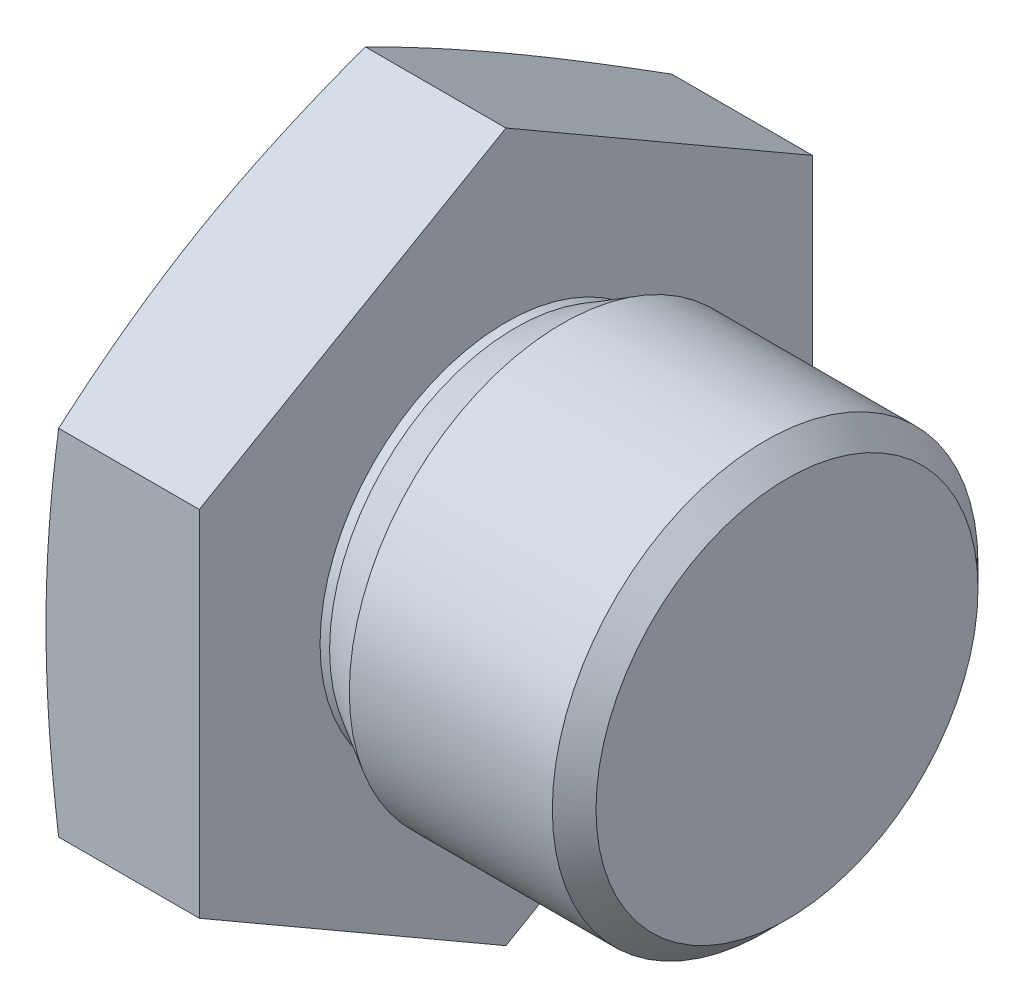
ISO-10303-21;
HEADER;
FILE_DESCRIPTION(('STEP AP214'),'2;1');
FILE_NAME('part.step','',(''),(''),'','','');
FILE_SCHEMA(('AUTOMOTIVE_DESIGN { 1 0 10303 214 1 1 1 1 }'));
ENDSEC;
DATA;
#1=APPLICATION_CONTEXT('core data for automotive mechanical design processes');
#2=APPLICATION_PROTOCOL_DEFINITION('international standard','automotive_design',2000,#1);
#3=PRODUCT_CONTEXT('',#1,'mechanical');
#4=PRODUCT('Part','Part','',(#3));
#5=PRODUCT_RELATED_PRODUCT_CATEGORY('part','',(#4));
#6=PRODUCT_DEFINITION_FORMATION('','',#4);
#7=PRODUCT_DEFINITION_CONTEXT('part definition',#1,'design');
#8=PRODUCT_DEFINITION('design','',#6,#7);
#9=PRODUCT_DEFINITION_SHAPE('','',#8);
#10=(LENGTH_UNIT() NAMED_UNIT(*) SI_UNIT(.MILLI.,.METRE.));
#11=(NAMED_UNIT(*) PLANE_ANGLE_UNIT() SI_UNIT($,.RADIAN.));
#12=(NAMED_UNIT(*) SI_UNIT($,.STERADIAN.) SOLID_ANGLE_UNIT());
#13=UNCERTAINTY_MEASURE_WITH_UNIT(LENGTH_MEASURE(1.E-05),#10,'distance_accuracy_value','');
#14=(GEOMETRIC_REPRESENTATION_CONTEXT(3) GLOBAL_UNCERTAINTY_ASSIGNED_CONTEXT((#13)) GLOBAL_UNIT_ASSIGNED_CONTEXT((#10,
#11,#12)) REPRESENTATION_CONTEXT('',''));
#15=CARTESIAN_POINT('',(0.,0.,0.));
#16=DIRECTION('',(0.,0.,1.));
#17=DIRECTION('',(1.,0.,0.));
#18=AXIS2_PLACEMENT_3D('',#15,#16,#17);
#19=CARTESIAN_POINT('',(11.,3.7375,0.));
#20=DIRECTION('',(1.,0.,0.));
#21=DIRECTION('',(0.,0.,-1.));
#22=AXIS2_PLACEMENT_3D('',#19,#20,#21);
#23=PLANE('',#22);
#24=CARTESIAN_POINT('',(11.,0.,0.));
#25=DIRECTION('',(-1.,0.,0.));
#26=DIRECTION('',(0.,0.,1.));
#27=AXIS2_PLACEMENT_3D('',#24,#25,#26);
#28=CIRCLE('',#27,7.475);
#29=CARTESIAN_POINT('',(11.,0.,7.475));
#30=VERTEX_POINT('',#29);
#31=EDGE_CURVE('E22',#30,#30,#28,.T.);
#32=ORIENTED_EDGE('',*,*,#31,.F.);
#33=EDGE_LOOP('',(#32));
#34=FACE_BOUND('',#33,.T.);
#35=ADVANCED_FACE('F17',(#34),#23,.T.);
#36=CARTESIAN_POINT('',(10.145,0.,0.));
#37=DIRECTION('',(-1.,0.,0.));
#38=DIRECTION('',(0.,0.,1.));
#39=AXIS2_PLACEMENT_3D('',#36,#37,#38);
#40=CONICAL_SURFACE('',#39,8.33,0.785398163397448);
#41=CARTESIAN_POINT('',(10.145,0.,0.));
#42=DIRECTION('',(-1.,0.,0.));
#43=DIRECTION('',(0.,0.,1.));
#44=AXIS2_PLACEMENT_3D('',#41,#42,#43);
#45=CIRCLE('',#44,8.33);
#46=CARTESIAN_POINT('',(10.145,0.,8.33));
#47=VERTEX_POINT('',#46);
#48=EDGE_CURVE('E268',#47,#47,#45,.T.);
#49=ORIENTED_EDGE('',*,*,#48,.F.);
#50=EDGE_LOOP('',(#49));
#51=FACE_BOUND('',#50,.T.);
#52=ORIENTED_EDGE('',*,*,#31,.T.);
#53=EDGE_LOOP('',(#52));
#54=FACE_BOUND('',#53,.T.);
#55=ADVANCED_FACE('F275',(#51,#54),#40,.T.);
#56=CARTESIAN_POINT('',(6.1725,0.,0.));
#57=DIRECTION('',(-1.,0.,0.));
#58=DIRECTION('',(0.,0.,1.));
#59=AXIS2_PLACEMENT_3D('',#56,#57,#58);
#60=CYLINDRICAL_SURFACE('',#59,8.33);
#61=CARTESIAN_POINT('',(2.2,0.,0.));
#62=DIRECTION('',(-1.,0.,0.));
#63=DIRECTION('',(0.,0.,1.));
#64=AXIS2_PLACEMENT_3D('',#61,#62,#63);
#65=CIRCLE('',#64,8.33);
#66=CARTESIAN_POINT('',(2.2,0.,8.33));
#67=VERTEX_POINT('',#66);
#68=EDGE_CURVE('E266',#67,#67,#65,.T.);
#69=ORIENTED_EDGE('',*,*,#68,.F.);
#70=EDGE_LOOP('',(#69));
#71=FACE_BOUND('',#70,.T.);
#72=ORIENTED_EDGE('',*,*,#48,.T.);
#73=EDGE_LOOP('',(#72));
#74=FACE_BOUND('',#73,.T.);
#75=ADVANCED_FACE('F282',(#71,#74),#60,.T.);
#76=CARTESIAN_POINT('',(2.2,0.,0.));
#77=DIRECTION('',(1.,0.,0.));
#78=DIRECTION('',(0.,0.,-1.));
#79=AXIS2_PLACEMENT_3D('',#76,#77,#78);
#80=CONICAL_SURFACE('',#79,8.33,0.523598775598299);
#81=ORIENTED_EDGE('',*,*,#68,.T.);
#82=EDGE_LOOP('',(#81));
#83=FACE_BOUND('',#82,.T.);
#84=CARTESIAN_POINT('',(0.372686398014834,0.,0.));
#85=DIRECTION('',(-1.,0.,0.));
#86=DIRECTION('',(0.,0.,1.));
#87=AXIS2_PLACEMENT_3D('',#84,#85,#86);
#88=CIRCLE('',#87,7.275);
#89=CARTESIAN_POINT('',(0.372686398014834,0.,7.275));
#90=VERTEX_POINT('',#89);
#91=EDGE_CURVE('E263',#90,#90,#88,.T.);
#92=ORIENTED_EDGE('',*,*,#91,.F.);
#93=EDGE_LOOP('',(#92));
#94=FACE_BOUND('',#93,.T.);
#95=ADVANCED_FACE('F288',(#83,#94),#80,.T.);
#96=CARTESIAN_POINT('',(0.186343199007418,0.,0.));
#97=DIRECTION('',(-1.,0.,0.));
#98=DIRECTION('',(0.,0.,1.));
#99=AXIS2_PLACEMENT_3D('',#96,#97,#98);
#100=CYLINDRICAL_SURFACE('',#99,7.275);
#101=ORIENTED_EDGE('',*,*,#91,.T.);
#102=EDGE_LOOP('',(#101));
#103=FACE_BOUND('',#102,.T.);
#104=CARTESIAN_POINT('',(0.,0.,0.));
#105=DIRECTION('',(-1.,0.,0.));
#106=DIRECTION('',(0.,0.,1.));
#107=AXIS2_PLACEMENT_3D('',#104,#105,#106);
#108=CIRCLE('',#107,7.275);
#109=CARTESIAN_POINT('',(0.,0.,7.275));
#110=VERTEX_POINT('',#109);
#111=EDGE_CURVE('E244',#110,#110,#108,.T.);
#112=ORIENTED_EDGE('',*,*,#111,.F.);
#113=EDGE_LOOP('',(#112));
#114=FACE_BOUND('',#113,.T.);
#115=ADVANCED_FACE('F291',(#103,#114),#100,.T.);
#116=CARTESIAN_POINT('',(0.,10.8375,0.));
#117=DIRECTION('',(1.,0.,0.));
#118=DIRECTION('',(0.,1.,0.));
#119=AXIS2_PLACEMENT_3D('',#116,#117,#118);
#120=PLANE('',#119);
#121=DIRECTION('',(0.,0.5,-0.866025403784439));
#122=VECTOR('',#121,1.);
#123=CARTESIAN_POINT('',(0.,-6.92820323027551,-12.));
#124=LINE('',#123,#122);
#125=CARTESIAN_POINT('',(0.,-6.92820323027551,-12.));
#126=VERTEX_POINT('',#125);
#127=CARTESIAN_POINT('',(0.,-13.856406460551,0.));
#128=VERTEX_POINT('',#127);
#129=EDGE_CURVE('E231',#126,#128,#124,.F.);
#130=ORIENTED_EDGE('',*,*,#129,.F.);
#131=DIRECTION('',(0.,1.,0.));
#132=VECTOR('',#131,1.);
#133=CARTESIAN_POINT('',(0.,6.92820323027551,-12.));
#134=LINE('',#133,#132);
#135=CARTESIAN_POINT('',(0.,6.92820323027551,-12.));
#136=VERTEX_POINT('',#135);
#137=EDGE_CURVE('E236',#136,#126,#134,.F.);
#138=ORIENTED_EDGE('',*,*,#137,.F.);
#139=DIRECTION('',(0.,0.5,0.866025403784439));
#140=VECTOR('',#139,1.);
#141=CARTESIAN_POINT('',(0.,13.856406460551,0.));
#142=LINE('',#141,#140);
#143=CARTESIAN_POINT('',(0.,13.856406460551,0.));
#144=VERTEX_POINT('',#143);
#145=EDGE_CURVE('E240',#144,#136,#142,.F.);
#146=ORIENTED_EDGE('',*,*,#145,.F.);
#147=DIRECTION('',(0.,-0.5,0.866025403784439));
#148=VECTOR('',#147,1.);
#149=CARTESIAN_POINT('',(0.,6.92820323027551,12.));
#150=LINE('',#149,#148);
#151=CARTESIAN_POINT('',(0.,6.92820323027551,12.));
#152=VERTEX_POINT('',#151);
#153=EDGE_CURVE('E83',#152,#144,#150,.F.);
#154=ORIENTED_EDGE('',*,*,#153,.F.);
#155=DIRECTION('',(0.,1.,0.));
#156=VECTOR('',#155,1.);
#157=CARTESIAN_POINT('',(0.,-6.92820323027551,12.));
#158=LINE('',#157,#156);
#159=CARTESIAN_POINT('',(0.,-6.92820323027551,12.));
#160=VERTEX_POINT('',#159);
#161=EDGE_CURVE('E80',#160,#152,#158,.T.);
#162=ORIENTED_EDGE('',*,*,#161,.F.);
#163=DIRECTION('',(0.,-0.5,-0.866025403784439));
#164=VECTOR('',#163,1.);
#165=CARTESIAN_POINT('',(0.,-13.856406460551,0.));
#166=LINE('',#165,#164);
#167=EDGE_CURVE('E221',#128,#160,#166,.F.);
#168=ORIENTED_EDGE('',*,*,#167,.F.);
#169=EDGE_LOOP('',(#130,#138,#146,#154,#162,#168));
#170=FACE_BOUND('',#169,.T.);
#171=ORIENTED_EDGE('',*,*,#111,.T.);
#172=EDGE_LOOP('',(#171));
#173=FACE_BOUND('',#172,.T.);
#174=ADVANCED_FACE('F307',(#170,#173),#120,.T.);
#175=CARTESIAN_POINT('',(0.,13.856406460551,0.));
#176=DIRECTION('',(0.,0.866025403784439,-0.5));
#177=DIRECTION('',(0.,0.5,0.866025403784439));
#178=AXIS2_PLACEMENT_3D('',#175,#176,#177);
#179=PLANE('',#178);
#180=ORIENTED_EDGE('',*,*,#145,.T.);
#181=DIRECTION('',(-1.,0.,0.));
#182=VECTOR('',#181,1.);
#183=CARTESIAN_POINT('',(0.,6.92820323027551,-12.));
#184=LINE('',#183,#182);
#185=CARTESIAN_POINT('',(-5.50257738807143,6.92820323027551,-12.));
#186=VERTEX_POINT('',#185);
#187=EDGE_CURVE('E191',#186,#136,#184,.F.);
#188=ORIENTED_EDGE('',*,*,#187,.F.);
#189=CARTESIAN_POINT('',(-6.,10.3923048454133,-5.99999999999998));
#190=CARTESIAN_POINT('',(-6.00001649763333,10.2473817681001,-6.25101413309561));
#191=CARTESIAN_POINT('',(-5.99718651408579,10.102459857364,-6.50202624562051));
#192=CARTESIAN_POINT('',(-5.9859550663348,9.81267449282766,-7.00394922028731));
#193=CARTESIAN_POINT('',(-5.97755378138162,9.66781103729674,-7.25486008542684));
#194=CARTESIAN_POINT('',(-5.95531374244449,9.37835264405024,-7.75621672920703));
#195=CARTESIAN_POINT('',(-5.9414811296808,9.2337575877372,-8.00666271326451));
#196=CARTESIAN_POINT('',(-5.90860818759455,8.94471621193807,-8.50729706163821));
#197=CARTESIAN_POINT('',(-5.88956783992914,8.80026989297768,-8.75748542504391));
#198=CARTESIAN_POINT('',(-5.82505721559326,8.36728561938567,-9.50743618578356));
#199=CARTESIAN_POINT('',(-5.77219088698397,8.07902190001621,-10.0067235937102));
#200=CARTESIAN_POINT('',(-5.64945119441183,7.50306214157445,-11.0043151584465));
#201=CARTESIAN_POINT('',(-5.57955852590088,7.21536712321424,-11.5026175473308));
#202=CARTESIAN_POINT('',(-5.50257738807144,6.9282032302755,-12.));
#203=B_SPLINE_CURVE_WITH_KNOTS('',3,(#189,#190,#191,#192,#193,#194,#195,#196,#197,#198,#199,
#200,#201,#202),.UNSPECIFIED.,.F.,.F.,(4,2,2,2,2,2,4),(0.,0.869520860817989,1.73901374714813,
2.60752631311552,3.47604193822736,5.21259039390097,6.95111699621967),.UNSPECIFIED.);
#204=CARTESIAN_POINT('',(-6.,10.3923048454133,-5.99999999999998));
#205=VERTEX_POINT('',#204);
#206=EDGE_CURVE('E185',#205,#186,#203,.T.);
#207=ORIENTED_EDGE('',*,*,#206,.F.);
#208=CARTESIAN_POINT('',(-5.50257738807144,13.856406460551,0.));
#209=CARTESIAN_POINT('',(-5.57955852590088,13.5692425676123,-0.497382452669172));
#210=CARTESIAN_POINT('',(-5.64945119441184,13.2815475492521,-0.995684841553498));
#211=CARTESIAN_POINT('',(-5.77219088698397,12.7055877908103,-1.99327640628974));
#212=CARTESIAN_POINT('',(-5.82505721559326,12.4173240714408,-2.49256381421642));
#213=CARTESIAN_POINT('',(-5.88956783992914,11.9843397978488,-3.24251457495606));
#214=CARTESIAN_POINT('',(-5.90860818759455,11.8398934788884,-3.49270293836176));
#215=CARTESIAN_POINT('',(-5.9414811296808,11.5508521030893,-3.99333728673546));
#216=CARTESIAN_POINT('',(-5.95531374244449,11.4062570467763,-4.24378327079294));
#217=CARTESIAN_POINT('',(-5.97755378138162,11.1167986535298,-4.74513991457312));
#218=CARTESIAN_POINT('',(-5.9859550663348,10.9719351979989,-4.99605077971266));
#219=CARTESIAN_POINT('',(-5.99718651408579,10.6821498334625,-5.49797375437945));
#220=CARTESIAN_POINT('',(-6.00001649763333,10.5372279227264,-5.74898586690435));
#221=CARTESIAN_POINT('',(-6.,10.3923048454133,-5.99999999999998));
#222=B_SPLINE_CURVE_WITH_KNOTS('',3,(#208,#209,#210,#211,#212,#213,#214,#215,#216,#217,#218,
#219,#220,#221),.UNSPECIFIED.,.F.,.F.,(4,2,2,2,2,2,4),(0.,1.73852660231868,3.47507505799229,
4.34359068310412,5.21210324907151,6.08159613540164,6.95111699621963),.UNSPECIFIED.);
#223=CARTESIAN_POINT('',(-5.50257738807144,13.856406460551,0.));
#224=VERTEX_POINT('',#223);
#225=EDGE_CURVE('E189',#224,#205,#222,.T.);
#226=ORIENTED_EDGE('',*,*,#225,.F.);
#227=DIRECTION('',(1.,0.,0.));
#228=VECTOR('',#227,1.);
#229=CARTESIAN_POINT('',(0.,13.856406460551,0.));
#230=LINE('',#229,#228);
#231=EDGE_CURVE('E248',#144,#224,#230,.F.);
#232=ORIENTED_EDGE('',*,*,#231,.F.);
#233=EDGE_LOOP('',(#180,#188,#207,#226,#232));
#234=FACE_BOUND('',#233,.T.);
#235=ADVANCED_FACE('F187',(#234),#179,.T.);
#236=CARTESIAN_POINT('',(0.,6.92820323027551,-12.));
#237=DIRECTION('',(0.,0.,-1.));
#238=DIRECTION('',(-1.,0.,0.));
#239=AXIS2_PLACEMENT_3D('',#236,#237,#238);
#240=PLANE('',#239);
#241=ORIENTED_EDGE('',*,*,#137,.T.);
#242=DIRECTION('',(1.,0.,0.));
#243=VECTOR('',#242,1.);
#244=CARTESIAN_POINT('',(0.,-6.92820323027551,-12.));
#245=LINE('',#244,#243);
#246=CARTESIAN_POINT('',(-5.50257738807143,-6.92820323027551,-12.));
#247=VERTEX_POINT('',#246);
#248=EDGE_CURVE('E234',#247,#126,#245,.T.);
#249=ORIENTED_EDGE('',*,*,#248,.F.);
#250=CARTESIAN_POINT('',(-5.99999999999999,0.,-12.));
#251=CARTESIAN_POINT('',(-6.00001649763332,-0.289846154626323,-12.));
#252=CARTESIAN_POINT('',(-5.99718651408578,-0.579689976098541,-12.));
#253=CARTESIAN_POINT('',(-5.98595506633479,-1.1592607051712,-12.));
#254=CARTESIAN_POINT('',(-5.97755378138162,-1.44898761623303,-12.));
#255=CARTESIAN_POINT('',(-5.95531374244449,-2.02790440272603,-12.));
#256=CARTESIAN_POINT('',(-5.94148112968079,-2.31709451535212,-12.));
#257=CARTESIAN_POINT('',(-5.90860818759455,-2.89517726695037,-12.));
#258=CARTESIAN_POINT('',(-5.88956783992914,-3.18406990487116,-12.));
#259=CARTESIAN_POINT('',(-5.82505721559326,-4.05003845205516,-12.));
#260=CARTESIAN_POINT('',(-5.77219088698397,-4.62656589079408,-12.));
#261=CARTESIAN_POINT('',(-5.64945119441183,-5.77848540767762,-12.));
#262=CARTESIAN_POINT('',(-5.57955852590087,-6.35387544439802,-12.));
#263=CARTESIAN_POINT('',(-5.50257738807143,-6.92820323027551,-12.));
#264=B_SPLINE_CURVE_WITH_KNOTS('',3,(#250,#251,#252,#253,#254,#255,#256,#257,#258,#259,#260,
#261,#262,#263),.UNSPECIFIED.,.F.,.F.,(4,2,2,2,2,2,4),(0.,0.869520860817986,1.73901374714813,
2.60752631311551,3.47604193822735,5.21259039390096,6.95111699621965),.UNSPECIFIED.);
#265=CARTESIAN_POINT('',(-6.,0.,-12.));
#266=VERTEX_POINT('',#265);
#267=EDGE_CURVE('E207',#266,#247,#264,.T.);
#268=ORIENTED_EDGE('',*,*,#267,.F.);
#269=CARTESIAN_POINT('',(-5.50257738807143,6.92820323027551,-12.));
#270=CARTESIAN_POINT('',(-5.57955852590087,6.35387544439802,-12.));
#271=CARTESIAN_POINT('',(-5.64945119441183,5.77848540767762,-12.));
#272=CARTESIAN_POINT('',(-5.77219088698397,4.62656589079408,-12.));
#273=CARTESIAN_POINT('',(-5.82505721559326,4.05003845205516,-12.));
#274=CARTESIAN_POINT('',(-5.88956783992914,3.18406990487116,-12.));
#275=CARTESIAN_POINT('',(-5.90860818759455,2.89517726695037,-12.));
#276=CARTESIAN_POINT('',(-5.94148112968079,2.31709451535211,-12.));
#277=CARTESIAN_POINT('',(-5.95531374244448,2.02790440272603,-12.));
#278=CARTESIAN_POINT('',(-5.97755378138162,1.44898761623303,-12.));
#279=CARTESIAN_POINT('',(-5.98595506633479,1.1592607051712,-12.));
#280=CARTESIAN_POINT('',(-5.99718651408579,0.579689976098541,-12.));
#281=CARTESIAN_POINT('',(-6.00001649763332,0.289846154626323,-12.));
#282=CARTESIAN_POINT('',(-5.99999999999999,0.,-12.));
#283=B_SPLINE_CURVE_WITH_KNOTS('',3,(#269,#270,#271,#272,#273,#274,#275,#276,#277,#278,#279,
#280,#281,#282),.UNSPECIFIED.,.F.,.F.,(4,2,2,2,2,2,4),(0.,1.73852660231869,3.4750750579923,
4.34359068310414,5.21210324907153,6.08159613540166,6.95111699621965),.UNSPECIFIED.);
#284=EDGE_CURVE('E196',#186,#266,#283,.T.);
#285=ORIENTED_EDGE('',*,*,#284,.F.);
#286=ORIENTED_EDGE('',*,*,#187,.T.);
#287=EDGE_LOOP('',(#241,#249,#268,#285,#286));
#288=FACE_BOUND('',#287,.T.);
#289=ADVANCED_FACE('F318',(#288),#240,.T.);
#290=CARTESIAN_POINT('',(0.,-6.92820323027551,-12.));
#291=DIRECTION('',(0.,-0.866025403784439,-0.5));
#292=DIRECTION('',(0.,0.5,-0.866025403784439));
#293=AXIS2_PLACEMENT_3D('',#290,#291,#292);
#294=PLANE('',#293);
#295=ORIENTED_EDGE('',*,*,#129,.T.);
#296=DIRECTION('',(1.,0.,0.));
#297=VECTOR('',#296,1.);
#298=CARTESIAN_POINT('',(0.,-13.856406460551,0.));
#299=LINE('',#298,#297);
#300=CARTESIAN_POINT('',(-5.50257738807144,-13.856406460551,0.));
#301=VERTEX_POINT('',#300);
#302=EDGE_CURVE('E217',#301,#128,#299,.T.);
#303=ORIENTED_EDGE('',*,*,#302,.F.);
#304=CARTESIAN_POINT('',(-5.99999999999999,-10.3923048454133,-5.99999999999998));
#305=CARTESIAN_POINT('',(-6.00001649763332,-10.5372279227264,-5.74898586690436));
#306=CARTESIAN_POINT('',(-5.99718651408579,-10.6821498334625,-5.49797375437946));
#307=CARTESIAN_POINT('',(-5.98595506633479,-10.9719351979989,-4.99605077971266));
#308=CARTESIAN_POINT('',(-5.97755378138162,-11.1167986535298,-4.74513991457313));
#309=CARTESIAN_POINT('',(-5.95531374244449,-11.4062570467763,-4.24378327079294));
#310=CARTESIAN_POINT('',(-5.94148112968079,-11.5508521030893,-3.99333728673547));
#311=CARTESIAN_POINT('',(-5.90860818759455,-11.8398934788885,-3.49270293836177));
#312=CARTESIAN_POINT('',(-5.88956783992914,-11.9843397978488,-3.24251457495607));
#313=CARTESIAN_POINT('',(-5.82505721559326,-12.4173240714408,-2.49256381421643));
#314=CARTESIAN_POINT('',(-5.77219088698397,-12.7055877908103,-1.99327640628974));
#315=CARTESIAN_POINT('',(-5.64945119441183,-13.2815475492521,-0.995684841553507));
#316=CARTESIAN_POINT('',(-5.57955852590088,-13.5692425676123,-0.497382452669181));
#317=CARTESIAN_POINT('',(-5.50257738807144,-13.856406460551,0.));
#318=B_SPLINE_CURVE_WITH_KNOTS('',3,(#304,#305,#306,#307,#308,#309,#310,#311,#312,#313,#314,
#315,#316,#317),.UNSPECIFIED.,.F.,.F.,(4,2,2,2,2,2,4),(0.,0.869520860817983,1.73901374714812,
2.6075263131155,3.47604193822733,5.21259039390094,6.95111699621962),.UNSPECIFIED.);
#319=CARTESIAN_POINT('',(-6.,-10.3923048454133,-5.99999999999998));
#320=VERTEX_POINT('',#319);
#321=EDGE_CURVE('E136',#320,#301,#318,.T.);
#322=ORIENTED_EDGE('',*,*,#321,.F.);
#323=CARTESIAN_POINT('',(-5.50257738807143,-6.92820323027551,-12.));
#324=CARTESIAN_POINT('',(-5.57955852590088,-7.21536712321426,-11.5026175473308));
#325=CARTESIAN_POINT('',(-5.64945119441183,-7.50306214157446,-11.0043151584465));
#326=CARTESIAN_POINT('',(-5.77219088698397,-8.07902190001623,-10.0067235937102));
#327=CARTESIAN_POINT('',(-5.82505721559326,-8.36728561938569,-9.50743618578356));
#328=CARTESIAN_POINT('',(-5.88956783992914,-8.80026989297769,-8.75748542504392));
#329=CARTESIAN_POINT('',(-5.90860818759455,-8.94471621193808,-8.50729706163821));
#330=CARTESIAN_POINT('',(-5.94148112968079,-9.23375758773721,-8.00666271326451));
#331=CARTESIAN_POINT('',(-5.95531374244449,-9.37835264405026,-7.75621672920704));
#332=CARTESIAN_POINT('',(-5.97755378138162,-9.66781103729676,-7.25486008542685));
#333=CARTESIAN_POINT('',(-5.98595506633479,-9.81267449282767,-7.00394922028731));
#334=CARTESIAN_POINT('',(-5.99718651408579,-10.102459857364,-6.50202624562052));
#335=CARTESIAN_POINT('',(-6.00001649763332,-10.2473817681001,-6.25101413309561));
#336=CARTESIAN_POINT('',(-5.99999999999999,-10.3923048454133,-5.99999999999998));
#337=B_SPLINE_CURVE_WITH_KNOTS('',3,(#323,#324,#325,#326,#327,#328,#329,#330,#331,#332,#333,
#334,#335,#336),.UNSPECIFIED.,.F.,.F.,(4,2,2,2,2,2,4),(0.,1.73852660231869,3.47507505799231,
4.34359068310415,5.21210324907154,6.08159613540168,6.95111699621967),.UNSPECIFIED.);
#338=EDGE_CURVE('E195',#247,#320,#337,.T.);
#339=ORIENTED_EDGE('',*,*,#338,.F.);
#340=ORIENTED_EDGE('',*,*,#248,.T.);
#341=EDGE_LOOP('',(#295,#303,#322,#339,#340));
#342=FACE_BOUND('',#341,.T.);
#343=ADVANCED_FACE('F120',(#342),#294,.T.);
#344=CARTESIAN_POINT('',(0.,-13.856406460551,0.));
#345=DIRECTION('',(0.,-0.866025403784439,0.5));
#346=DIRECTION('',(0.,-0.5,-0.866025403784439));
#347=AXIS2_PLACEMENT_3D('',#344,#345,#346);
#348=PLANE('',#347);
#349=DIRECTION('',(1.,0.,0.));
#350=VECTOR('',#349,1.);
#351=CARTESIAN_POINT('',(0.,-6.92820323027551,12.));
#352=LINE('',#351,#350);
#353=CARTESIAN_POINT('',(-5.50257738807144,-6.92820323027551,12.));
#354=VERTEX_POINT('',#353);
#355=EDGE_CURVE('E218',#354,#160,#352,.T.);
#356=ORIENTED_EDGE('',*,*,#355,.F.);
#357=CARTESIAN_POINT('',(-6.,-10.3923048454133,5.99999999999998));
#358=CARTESIAN_POINT('',(-6.00001649763332,-10.2473817681001,6.25101413309561));
#359=CARTESIAN_POINT('',(-5.99718651408579,-10.102459857364,6.50202624562051));
#360=CARTESIAN_POINT('',(-5.9859550663348,-9.81267449282766,7.00394922028731));
#361=CARTESIAN_POINT('',(-5.97755378138162,-9.66781103729674,7.25486008542684));
#362=CARTESIAN_POINT('',(-5.95531374244449,-9.37835264405024,7.75621672920703));
#363=CARTESIAN_POINT('',(-5.9414811296808,-9.2337575877372,8.00666271326451));
#364=CARTESIAN_POINT('',(-5.90860818759455,-8.94471621193807,8.50729706163821));
#365=CARTESIAN_POINT('',(-5.88956783992914,-8.80026989297768,8.75748542504391));
#366=CARTESIAN_POINT('',(-5.82505721559326,-8.36728561938568,9.50743618578356));
#367=CARTESIAN_POINT('',(-5.77219088698397,-8.07902190001621,10.0067235937102));
#368=CARTESIAN_POINT('',(-5.64945119441183,-7.50306214157444,11.0043151584465));
#369=CARTESIAN_POINT('',(-5.57955852590088,-7.21536712321424,11.5026175473308));
#370=CARTESIAN_POINT('',(-5.50257738807144,-6.9282032302755,12.));
#371=B_SPLINE_CURVE_WITH_KNOTS('',3,(#357,#358,#359,#360,#361,#362,#363,#364,#365,#366,#367,
#368,#369,#370),.UNSPECIFIED.,.F.,.F.,(4,2,2,2,2,2,4),(0.,0.869520860817988,1.73901374714813,
2.60752631311552,3.47604193822736,5.21259039390097,6.95111699621967),.UNSPECIFIED.);
#372=CARTESIAN_POINT('',(-6.,-10.3923048454133,5.99999999999998));
#373=VERTEX_POINT('',#372);
#374=EDGE_CURVE('E95',#373,#354,#371,.T.);
#375=ORIENTED_EDGE('',*,*,#374,.F.);
#376=CARTESIAN_POINT('',(-5.50257738807144,-13.856406460551,0.));
#377=CARTESIAN_POINT('',(-5.57955852590088,-13.5692425676123,0.497382452669172));
#378=CARTESIAN_POINT('',(-5.64945119441183,-13.2815475492521,0.995684841553498));
#379=CARTESIAN_POINT('',(-5.77219088698397,-12.7055877908103,1.99327640628974));
#380=CARTESIAN_POINT('',(-5.82505721559326,-12.4173240714408,2.49256381421642));
#381=CARTESIAN_POINT('',(-5.88956783992915,-11.9843397978488,3.24251457495606));
#382=CARTESIAN_POINT('',(-5.90860818759456,-11.8398934788884,3.49270293836176));
#383=CARTESIAN_POINT('',(-5.9414811296808,-11.5508521030893,3.99333728673546));
#384=CARTESIAN_POINT('',(-5.95531374244449,-11.4062570467763,4.24378327079294));
#385=CARTESIAN_POINT('',(-5.97755378138162,-11.1167986535298,4.74513991457312));
#386=CARTESIAN_POINT('',(-5.9859550663348,-10.9719351979989,4.99605077971266));
#387=CARTESIAN_POINT('',(-5.99718651408579,-10.6821498334625,5.49797375437945));
#388=CARTESIAN_POINT('',(-6.00001649763333,-10.5372279227264,5.74898586690435));
#389=CARTESIAN_POINT('',(-6.,-10.3923048454133,5.99999999999998));
#390=B_SPLINE_CURVE_WITH_KNOTS('',3,(#376,#377,#378,#379,#380,#381,#382,#383,#384,#385,#386,
#387,#388,#389),.UNSPECIFIED.,.F.,.F.,(4,2,2,2,2,2,4),(0.,1.73852660231868,3.47507505799229,
4.34359068310412,5.21210324907151,6.08159613540164,6.95111699621963),.UNSPECIFIED.);
#391=EDGE_CURVE('E129',#301,#373,#390,.T.);
#392=ORIENTED_EDGE('',*,*,#391,.F.);
#393=ORIENTED_EDGE('',*,*,#302,.T.);
#394=ORIENTED_EDGE('',*,*,#167,.T.);
#395=EDGE_LOOP('',(#356,#375,#392,#393,#394));
#396=FACE_BOUND('',#395,.T.);
#397=ADVANCED_FACE('F113',(#396),#348,.T.);
#398=CARTESIAN_POINT('',(0.,-6.92820323027551,12.));
#399=DIRECTION('',(0.,0.,1.));
#400=DIRECTION('',(1.,0.,0.));
#401=AXIS2_PLACEMENT_3D('',#398,#399,#400);
#402=PLANE('',#401);
#403=DIRECTION('',(1.,0.,0.));
#404=VECTOR('',#403,1.);
#405=CARTESIAN_POINT('',(0.,6.92820323027551,12.));
#406=LINE('',#405,#404);
#407=CARTESIAN_POINT('',(-5.50257738807144,6.92820323027551,12.));
#408=VERTEX_POINT('',#407);
#409=EDGE_CURVE('E75',#408,#152,#406,.T.);
#410=ORIENTED_EDGE('',*,*,#409,.F.);
#411=CARTESIAN_POINT('',(-5.99999999999999,0.,12.));
#412=CARTESIAN_POINT('',(-6.00001649763332,0.289846154626323,12.));
#413=CARTESIAN_POINT('',(-5.99718651408579,0.579689976098541,12.));
#414=CARTESIAN_POINT('',(-5.98595506633479,1.1592607051712,12.));
#415=CARTESIAN_POINT('',(-5.97755378138162,1.44898761623303,12.));
#416=CARTESIAN_POINT('',(-5.95531374244449,2.02790440272603,12.));
#417=CARTESIAN_POINT('',(-5.94148112968079,2.31709451535212,12.));
#418=CARTESIAN_POINT('',(-5.90860818759455,2.89517726695037,12.));
#419=CARTESIAN_POINT('',(-5.88956783992914,3.18406990487116,12.));
#420=CARTESIAN_POINT('',(-5.82505721559326,4.05003845205516,12.));
#421=CARTESIAN_POINT('',(-5.77219088698397,4.62656589079408,12.));
#422=CARTESIAN_POINT('',(-5.64945119441183,5.77848540767762,12.));
#423=CARTESIAN_POINT('',(-5.57955852590087,6.35387544439802,12.));
#424=CARTESIAN_POINT('',(-5.50257738807144,6.92820323027551,12.));
#425=B_SPLINE_CURVE_WITH_KNOTS('',3,(#411,#412,#413,#414,#415,#416,#417,#418,#419,#420,#421,
#422,#423,#424),.UNSPECIFIED.,.F.,.F.,(4,2,2,2,2,2,4),(0.,0.869520860817986,1.73901374714813,
2.60752631311551,3.47604193822735,5.21259039390096,6.95111699621965),.UNSPECIFIED.);
#426=CARTESIAN_POINT('',(-6.,0.,12.));
#427=VERTEX_POINT('',#426);
#428=EDGE_CURVE('E37',#427,#408,#425,.T.);
#429=ORIENTED_EDGE('',*,*,#428,.F.);
#430=CARTESIAN_POINT('',(-5.50257738807144,-6.92820323027551,12.));
#431=CARTESIAN_POINT('',(-5.57955852590087,-6.35387544439802,12.));
#432=CARTESIAN_POINT('',(-5.64945119441183,-5.77848540767762,12.));
#433=CARTESIAN_POINT('',(-5.77219088698397,-4.62656589079408,12.));
#434=CARTESIAN_POINT('',(-5.82505721559326,-4.05003845205516,12.));
#435=CARTESIAN_POINT('',(-5.88956783992914,-3.18406990487116,12.));
#436=CARTESIAN_POINT('',(-5.90860818759455,-2.89517726695037,12.));
#437=CARTESIAN_POINT('',(-5.94148112968079,-2.31709451535212,12.));
#438=CARTESIAN_POINT('',(-5.95531374244449,-2.02790440272603,12.));
#439=CARTESIAN_POINT('',(-5.97755378138162,-1.44898761623303,12.));
#440=CARTESIAN_POINT('',(-5.98595506633479,-1.1592607051712,12.));
#441=CARTESIAN_POINT('',(-5.99718651408579,-0.579689976098541,12.));
#442=CARTESIAN_POINT('',(-6.00001649763332,-0.289846154626324,12.));
#443=CARTESIAN_POINT('',(-5.99999999999999,0.,12.));
#444=B_SPLINE_CURVE_WITH_KNOTS('',3,(#430,#431,#432,#433,#434,#435,#436,#437,#438,#439,#440,
#441,#442,#443),.UNSPECIFIED.,.F.,.F.,(4,2,2,2,2,2,4),(0.,1.73852660231869,3.4750750579923,
4.34359068310414,5.21210324907152,6.08159613540166,6.95111699621965),.UNSPECIFIED.);
#445=EDGE_CURVE('E93',#354,#427,#444,.T.);
#446=ORIENTED_EDGE('',*,*,#445,.F.);
#447=ORIENTED_EDGE('',*,*,#355,.T.);
#448=ORIENTED_EDGE('',*,*,#161,.T.);
#449=EDGE_LOOP('',(#410,#429,#446,#447,#448));
#450=FACE_BOUND('',#449,.T.);
#451=ADVANCED_FACE('F76',(#450),#402,.T.);
#452=CARTESIAN_POINT('',(0.,6.92820323027551,12.));
#453=DIRECTION('',(0.,0.866025403784439,0.5));
#454=DIRECTION('',(0.,-0.5,0.866025403784439));
#455=AXIS2_PLACEMENT_3D('',#452,#453,#454);
#456=PLANE('',#455);
#457=ORIENTED_EDGE('',*,*,#231,.T.);
#458=CARTESIAN_POINT('',(-5.99999999999999,10.3923048454133,5.99999999999998));
#459=CARTESIAN_POINT('',(-6.00001649763332,10.5372279227264,5.74898586690436));
#460=CARTESIAN_POINT('',(-5.99718651408579,10.6821498334625,5.49797375437946));
#461=CARTESIAN_POINT('',(-5.98595506633479,10.9719351979989,4.99605077971266));
#462=CARTESIAN_POINT('',(-5.97755378138162,11.1167986535298,4.74513991457313));
#463=CARTESIAN_POINT('',(-5.95531374244449,11.4062570467763,4.24378327079294));
#464=CARTESIAN_POINT('',(-5.94148112968079,11.5508521030893,3.99333728673547));
#465=CARTESIAN_POINT('',(-5.90860818759455,11.8398934788885,3.49270293836177));
#466=CARTESIAN_POINT('',(-5.88956783992914,11.9843397978488,3.24251457495607));
#467=CARTESIAN_POINT('',(-5.82505721559326,12.4173240714408,2.49256381421642));
#468=CARTESIAN_POINT('',(-5.77219088698397,12.7055877908103,1.99327640628974));
#469=CARTESIAN_POINT('',(-5.64945119441183,13.2815475492521,0.995684841553505));
#470=CARTESIAN_POINT('',(-5.57955852590087,13.5692425676123,0.497382452669178));
#471=CARTESIAN_POINT('',(-5.50257738807144,13.856406460551,0.));
#472=B_SPLINE_CURVE_WITH_KNOTS('',3,(#458,#459,#460,#461,#462,#463,#464,#465,#466,#467,#468,
#469,#470,#471),.UNSPECIFIED.,.F.,.F.,(4,2,2,2,2,2,4),(0.,0.869520860817982,1.73901374714812,
2.6075263131155,3.47604193822734,5.21259039390094,6.95111699621963),.UNSPECIFIED.);
#473=CARTESIAN_POINT('',(-6.,10.3923048454133,5.99999999999999));
#474=VERTEX_POINT('',#473);
#475=EDGE_CURVE('E71',#474,#224,#472,.T.);
#476=ORIENTED_EDGE('',*,*,#475,.F.);
#477=CARTESIAN_POINT('',(-5.50257738807144,6.92820323027551,12.));
#478=CARTESIAN_POINT('',(-5.57955852590087,7.21536712321426,11.5026175473308));
#479=CARTESIAN_POINT('',(-5.64945119441183,7.50306214157446,11.0043151584465));
#480=CARTESIAN_POINT('',(-5.77219088698397,8.07902190001623,10.0067235937102));
#481=CARTESIAN_POINT('',(-5.82505721559326,8.36728561938569,9.50743618578356));
#482=CARTESIAN_POINT('',(-5.88956783992914,8.80026989297769,8.75748542504392));
#483=CARTESIAN_POINT('',(-5.90860818759455,8.94471621193808,8.50729706163821));
#484=CARTESIAN_POINT('',(-5.94148112968079,9.23375758773721,8.00666271326451));
#485=CARTESIAN_POINT('',(-5.95531374244449,9.37835264405026,7.75621672920704));
#486=CARTESIAN_POINT('',(-5.97755378138162,9.66781103729676,7.25486008542685));
#487=CARTESIAN_POINT('',(-5.98595506633479,9.81267449282767,7.00394922028731));
#488=CARTESIAN_POINT('',(-5.99718651408579,10.102459857364,6.50202624562051));
#489=CARTESIAN_POINT('',(-6.00001649763332,10.2473817681001,6.25101413309561));
#490=CARTESIAN_POINT('',(-5.99999999999999,10.3923048454133,5.99999999999998));
#491=B_SPLINE_CURVE_WITH_KNOTS('',3,(#477,#478,#479,#480,#481,#482,#483,#484,#485,#486,#487,
#488,#489,#490),.UNSPECIFIED.,.F.,.F.,(4,2,2,2,2,2,4),(0.,1.73852660231869,3.47507505799231,
4.34359068310415,5.21210324907154,6.08159613540168,6.95111699621967),.UNSPECIFIED.);
#492=EDGE_CURVE('E86',#408,#474,#491,.T.);
#493=ORIENTED_EDGE('',*,*,#492,.F.);
#494=ORIENTED_EDGE('',*,*,#409,.T.);
#495=ORIENTED_EDGE('',*,*,#153,.T.);
#496=EDGE_LOOP('',(#457,#476,#493,#494,#495));
#497=FACE_BOUND('',#496,.T.);
#498=ADVANCED_FACE('F87',(#497),#456,.T.);
#499=CARTESIAN_POINT('',(-5.49959285239987,0.,0.));
#500=DIRECTION('',(1.,0.,0.));
#501=DIRECTION('',(0.,0.,-1.));
#502=AXIS2_PLACEMENT_3D('',#499,#500,#501);
#503=CONICAL_SURFACE('',#502,13.8675448993144,1.30899693899575);
#504=ORIENTED_EDGE('',*,*,#225,.T.);
#505=CARTESIAN_POINT('',(-6.,0.,0.));
#506=DIRECTION('',(-1.,0.,0.));
#507=DIRECTION('',(0.,0.,1.));
#508=AXIS2_PLACEMENT_3D('',#505,#506,#507);
#509=CIRCLE('',#508,12.);
#510=EDGE_CURVE('E90',#474,#205,#509,.T.);
#511=ORIENTED_EDGE('',*,*,#510,.F.);
#512=ORIENTED_EDGE('',*,*,#475,.T.);
#513=EDGE_LOOP('',(#504,#511,#512));
#514=FACE_BOUND('',#513,.T.);
#515=ADVANCED_FACE('F198',(#514),#503,.T.);
#516=CARTESIAN_POINT('',(-5.49959285239987,0.,0.));
#517=DIRECTION('',(1.,0.,0.));
#518=DIRECTION('',(0.,0.,-1.));
#519=AXIS2_PLACEMENT_3D('',#516,#517,#518);
#520=CONICAL_SURFACE('',#519,13.8675448993143,1.30899693899575);
#521=CARTESIAN_POINT('',(-6.,0.,0.));
#522=DIRECTION('',(-1.,0.,0.));
#523=DIRECTION('',(0.,0.,1.));
#524=AXIS2_PLACEMENT_3D('',#521,#522,#523);
#525=CIRCLE('',#524,12.);
#526=EDGE_CURVE('E176',#205,#266,#525,.T.);
#527=ORIENTED_EDGE('',*,*,#526,.F.);
#528=ORIENTED_EDGE('',*,*,#206,.T.);
#529=ORIENTED_EDGE('',*,*,#284,.T.);
#530=EDGE_LOOP('',(#527,#528,#529));
#531=FACE_BOUND('',#530,.T.);
#532=ADVANCED_FACE('F200',(#531),#520,.T.);
#533=CARTESIAN_POINT('',(-5.49959285239986,0.,0.));
#534=DIRECTION('',(1.,0.,0.));
#535=DIRECTION('',(0.,0.,-1.));
#536=AXIS2_PLACEMENT_3D('',#533,#534,#535);
#537=CONICAL_SURFACE('',#536,13.8675448993143,1.30899693899575);
#538=CARTESIAN_POINT('',(-6.,0.,0.));
#539=DIRECTION('',(-1.,0.,0.));
#540=DIRECTION('',(0.,0.,1.));
#541=AXIS2_PLACEMENT_3D('',#538,#539,#540);
#542=CIRCLE('',#541,12.);
#543=EDGE_CURVE('E171',#266,#320,#542,.T.);
#544=ORIENTED_EDGE('',*,*,#543,.F.);
#545=ORIENTED_EDGE('',*,*,#267,.T.);
#546=ORIENTED_EDGE('',*,*,#338,.T.);
#547=EDGE_LOOP('',(#544,#545,#546));
#548=FACE_BOUND('',#547,.T.);
#549=ADVANCED_FACE('F146',(#548),#537,.T.);
#550=CARTESIAN_POINT('',(-5.49959285239987,0.,0.));
#551=DIRECTION('',(1.,0.,0.));
#552=DIRECTION('',(0.,0.,-1.));
#553=AXIS2_PLACEMENT_3D('',#550,#551,#552);
#554=CONICAL_SURFACE('',#553,13.8675448993143,1.30899693899575);
#555=ORIENTED_EDGE('',*,*,#321,.T.);
#556=ORIENTED_EDGE('',*,*,#391,.T.);
#557=CARTESIAN_POINT('',(-6.,0.,0.));
#558=DIRECTION('',(-1.,0.,0.));
#559=DIRECTION('',(0.,0.,1.));
#560=AXIS2_PLACEMENT_3D('',#557,#558,#559);
#561=CIRCLE('',#560,12.);
#562=EDGE_CURVE('E168',#320,#373,#561,.T.);
#563=ORIENTED_EDGE('',*,*,#562,.F.);
#564=EDGE_LOOP('',(#555,#556,#563));
#565=FACE_BOUND('',#564,.T.);
#566=ADVANCED_FACE('F141',(#565),#554,.T.);
#567=CARTESIAN_POINT('',(-5.49959285239986,0.,0.));
#568=DIRECTION('',(1.,0.,0.));
#569=DIRECTION('',(0.,0.,-1.));
#570=AXIS2_PLACEMENT_3D('',#567,#568,#569);
#571=CONICAL_SURFACE('',#570,13.8675448993143,1.30899693899575);
#572=ORIENTED_EDGE('',*,*,#445,.T.);
#573=CARTESIAN_POINT('',(-6.,0.,0.));
#574=DIRECTION('',(-1.,0.,0.));
#575=DIRECTION('',(0.,0.,1.));
#576=AXIS2_PLACEMENT_3D('',#573,#574,#575);
#577=CIRCLE('',#576,12.);
#578=EDGE_CURVE('E28',#373,#427,#577,.T.);
#579=ORIENTED_EDGE('',*,*,#578,.F.);
#580=ORIENTED_EDGE('',*,*,#374,.T.);
#581=EDGE_LOOP('',(#572,#579,#580));
#582=FACE_BOUND('',#581,.T.);
#583=ADVANCED_FACE('F145',(#582),#571,.T.);
#584=CARTESIAN_POINT('',(-5.49959285239986,0.,0.));
#585=DIRECTION('',(1.,0.,0.));
#586=DIRECTION('',(0.,0.,-1.));
#587=AXIS2_PLACEMENT_3D('',#584,#585,#586);
#588=CONICAL_SURFACE('',#587,13.8675448993143,1.30899693899575);
#589=ORIENTED_EDGE('',*,*,#492,.T.);
#590=CARTESIAN_POINT('',(-6.,0.,0.));
#591=DIRECTION('',(-1.,0.,0.));
#592=DIRECTION('',(0.,0.,1.));
#593=AXIS2_PLACEMENT_3D('',#590,#591,#592);
#594=CIRCLE('',#593,12.);
#595=EDGE_CURVE('E11',#427,#474,#594,.T.);
#596=ORIENTED_EDGE('',*,*,#595,.F.);
#597=ORIENTED_EDGE('',*,*,#428,.T.);
#598=EDGE_LOOP('',(#589,#596,#597));
#599=FACE_BOUND('',#598,.T.);
#600=ADVANCED_FACE('F19',(#599),#588,.T.);
#601=CARTESIAN_POINT('',(-6.,6.,0.));
#602=DIRECTION('',(-1.,0.,0.));
#603=DIRECTION('',(0.,0.,1.));
#604=AXIS2_PLACEMENT_3D('',#601,#602,#603);
#605=PLANE('',#604);
#606=ORIENTED_EDGE('',*,*,#578,.T.);
#607=ORIENTED_EDGE('',*,*,#595,.T.);
#608=ORIENTED_EDGE('',*,*,#510,.T.);
#609=ORIENTED_EDGE('',*,*,#526,.T.);
#610=ORIENTED_EDGE('',*,*,#543,.T.);
#611=ORIENTED_EDGE('',*,*,#562,.T.);
#612=EDGE_LOOP('',(#606,#607,#608,#609,#610,#611));
#613=FACE_BOUND('',#612,.T.);
#614=ADVANCED_FACE('F159',(#613),#605,.T.);
#615=CLOSED_SHELL('',(#35,#55,#75,#95,#115,#174,#235,#289,#343,#397,#451,#498,#515,#532,#549,
#566,#583,#600,#614));
#616=MANIFOLD_SOLID_BREP('B1',#615);
#617=ADVANCED_BREP_SHAPE_REPRESENTATION('',(#18,#616),#14);
#618=SHAPE_DEFINITION_REPRESENTATION(#9,#617);
ENDSEC;
END-ISO-10303-21;
